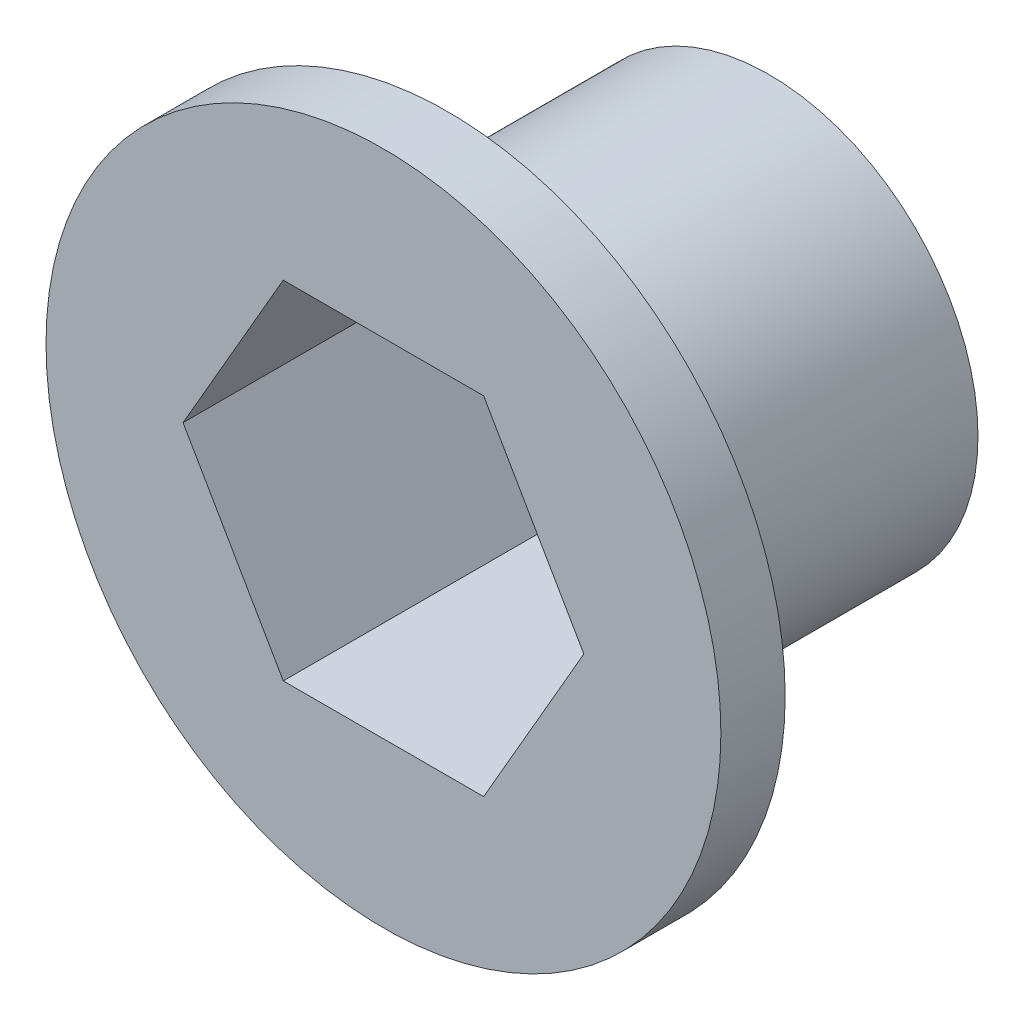
ISO-10303-21;
HEADER;
FILE_DESCRIPTION(('STEP AP214'),'2;1');
FILE_NAME('part.step','',(''),(''),'','','');
FILE_SCHEMA(('AUTOMOTIVE_DESIGN { 1 0 10303 214 1 1 1 1 }'));
ENDSEC;
DATA;
#1=APPLICATION_CONTEXT('core data for automotive mechanical design processes');
#2=APPLICATION_PROTOCOL_DEFINITION('international standard','automotive_design',2000,#1);
#3=PRODUCT_CONTEXT('',#1,'mechanical');
#4=PRODUCT('Part','Part','',(#3));
#5=PRODUCT_RELATED_PRODUCT_CATEGORY('part','',(#4));
#6=PRODUCT_DEFINITION_FORMATION('','',#4);
#7=PRODUCT_DEFINITION_CONTEXT('part definition',#1,'design');
#8=PRODUCT_DEFINITION('design','',#6,#7);
#9=PRODUCT_DEFINITION_SHAPE('','',#8);
#10=(LENGTH_UNIT() NAMED_UNIT(*) SI_UNIT(.MILLI.,.METRE.));
#11=(NAMED_UNIT(*) PLANE_ANGLE_UNIT() SI_UNIT($,.RADIAN.));
#12=(NAMED_UNIT(*) SI_UNIT($,.STERADIAN.) SOLID_ANGLE_UNIT());
#13=UNCERTAINTY_MEASURE_WITH_UNIT(LENGTH_MEASURE(1.E-05),#10,'distance_accuracy_value','');
#14=(GEOMETRIC_REPRESENTATION_CONTEXT(3) GLOBAL_UNCERTAINTY_ASSIGNED_CONTEXT((#13)) GLOBAL_UNIT_ASSIGNED_CONTEXT((#10,
#11,#12)) REPRESENTATION_CONTEXT('',''));
#15=CARTESIAN_POINT('',(0.,0.,0.));
#16=DIRECTION('',(0.,0.,1.));
#17=DIRECTION('',(1.,0.,0.));
#18=AXIS2_PLACEMENT_3D('',#15,#16,#17);
#19=CARTESIAN_POINT('',(0.,0.,-2.5));
#20=DIRECTION('',(0.,0.,1.));
#21=DIRECTION('',(1.,0.,0.));
#22=AXIS2_PLACEMENT_3D('',#19,#20,#21);
#23=PLANE('',#22);
#24=CARTESIAN_POINT('',(0.,0.,-2.5));
#25=DIRECTION('',(0.,0.,1.));
#26=DIRECTION('',(1.,0.,0.));
#27=AXIS2_PLACEMENT_3D('',#24,#25,#26);
#28=CIRCLE('',#27,3.25);
#29=CARTESIAN_POINT('',(3.25,0.,-2.5));
#30=VERTEX_POINT('',#29);
#31=EDGE_CURVE('E41',#30,#30,#28,.T.);
#32=ORIENTED_EDGE('',*,*,#31,.F.);
#33=EDGE_LOOP('',(#32));
#34=FACE_BOUND('',#33,.T.);
#35=DIRECTION('',(0.499999999999995,0.866025403784442,0.));
#36=VECTOR('',#35,1.);
#37=CARTESIAN_POINT('',(1.55884572681201,-2.69999999999997,-2.5));
#38=LINE('',#37,#36);
#39=CARTESIAN_POINT('',(1.55884572681201,-2.69999999999997,-2.5));
#40=VERTEX_POINT('',#39);
#41=CARTESIAN_POINT('',(3.11769145362396,0.,-2.5));
#42=VERTEX_POINT('',#41);
#43=EDGE_CURVE('E52',#40,#42,#38,.T.);
#44=ORIENTED_EDGE('',*,*,#43,.T.);
#45=DIRECTION('',(-0.500000000000001,0.866025403784438,0.));
#46=VECTOR('',#45,1.);
#47=CARTESIAN_POINT('',(3.11769145362396,0.,-2.5));
#48=LINE('',#47,#46);
#49=CARTESIAN_POINT('',(1.55884572681198,2.69999999999999,-2.5));
#50=VERTEX_POINT('',#49);
#51=EDGE_CURVE('E98',#42,#50,#48,.T.);
#52=ORIENTED_EDGE('',*,*,#51,.T.);
#53=DIRECTION('',(-1.,0.,0.));
#54=VECTOR('',#53,1.);
#55=CARTESIAN_POINT('',(1.55884572681198,2.69999999999999,-2.5));
#56=LINE('',#55,#54);
#57=CARTESIAN_POINT('',(-1.55884572681199,2.69999999999998,-2.5));
#58=VERTEX_POINT('',#57);
#59=EDGE_CURVE('E131',#50,#58,#56,.T.);
#60=ORIENTED_EDGE('',*,*,#59,.T.);
#61=DIRECTION('',(-0.499999999999995,-0.866025403784441,0.));
#62=VECTOR('',#61,1.);
#63=CARTESIAN_POINT('',(-1.55884572681199,2.69999999999998,-2.5));
#64=LINE('',#63,#62);
#65=CARTESIAN_POINT('',(-3.11769145362396,0.,-2.5));
#66=VERTEX_POINT('',#65);
#67=EDGE_CURVE('E134',#58,#66,#64,.T.);
#68=ORIENTED_EDGE('',*,*,#67,.T.);
#69=DIRECTION('',(0.500000000000007,-0.866025403784435,0.));
#70=VECTOR('',#69,1.);
#71=CARTESIAN_POINT('',(-3.11769145362396,0.,-2.5));
#72=LINE('',#71,#70);
#73=CARTESIAN_POINT('',(-1.55884572681196,-2.7,-2.5));
#74=VERTEX_POINT('',#73);
#75=EDGE_CURVE('E137',#66,#74,#72,.T.);
#76=ORIENTED_EDGE('',*,*,#75,.T.);
#77=DIRECTION('',(1.,0.,0.));
#78=VECTOR('',#77,1.);
#79=CARTESIAN_POINT('',(-1.55884572681196,-2.7,-2.5));
#80=LINE('',#79,#78);
#81=EDGE_CURVE('E140',#74,#40,#80,.T.);
#82=ORIENTED_EDGE('',*,*,#81,.T.);
#83=EDGE_LOOP('',(#44,#52,#60,#68,#76,#82));
#84=FACE_BOUND('',#83,.T.);
#85=ADVANCED_FACE('F37',(#34,#84),#23,.F.);
#86=CARTESIAN_POINT('',(0.,0.,2.5));
#87=DIRECTION('',(0.,0.,-1.));
#88=DIRECTION('',(-1.,0.,0.));
#89=AXIS2_PLACEMENT_3D('',#86,#87,#88);
#90=CYLINDRICAL_SURFACE('',#89,3.25);
#91=CARTESIAN_POINT('',(0.,0.,2.5));
#92=DIRECTION('',(0.,0.,1.));
#93=DIRECTION('',(1.,0.,0.));
#94=AXIS2_PLACEMENT_3D('',#91,#92,#93);
#95=CIRCLE('',#94,3.25);
#96=CARTESIAN_POINT('',(3.25,0.,2.5));
#97=VERTEX_POINT('',#96);
#98=EDGE_CURVE('E11',#97,#97,#95,.T.);
#99=ORIENTED_EDGE('',*,*,#98,.F.);
#100=EDGE_LOOP('',(#99));
#101=FACE_BOUND('',#100,.T.);
#102=ORIENTED_EDGE('',*,*,#31,.T.);
#103=EDGE_LOOP('',(#102));
#104=FACE_BOUND('',#103,.T.);
#105=ADVANCED_FACE('F39',(#101,#104),#90,.T.);
#106=CARTESIAN_POINT('',(1.55884572681201,-2.69999999999997,2.5));
#107=DIRECTION('',(-0.866025403784442,0.499999999999995,0.));
#108=DIRECTION('',(-0.499999999999995,-0.866025403784442,0.));
#109=AXIS2_PLACEMENT_3D('',#106,#107,#108);
#110=PLANE('',#109);
#111=ORIENTED_EDGE('',*,*,#43,.F.);
#112=DIRECTION('',(0.,0.,-1.));
#113=VECTOR('',#112,1.);
#114=CARTESIAN_POINT('',(1.55884572681201,-2.69999999999997,2.5));
#115=LINE('',#114,#113);
#116=CARTESIAN_POINT('',(1.55884572681199,-2.7,3.5));
#117=VERTEX_POINT('',#116);
#118=EDGE_CURVE('E104',#117,#40,#115,.T.);
#119=ORIENTED_EDGE('',*,*,#118,.F.);
#120=DIRECTION('',(0.5,0.866025403784439,0.));
#121=VECTOR('',#120,1.);
#122=CARTESIAN_POINT('',(1.55884572681199,-2.7,3.5));
#123=LINE('',#122,#121);
#124=CARTESIAN_POINT('',(3.11769145362398,0.,3.5));
#125=VERTEX_POINT('',#124);
#126=EDGE_CURVE('E102',#117,#125,#123,.T.);
#127=ORIENTED_EDGE('',*,*,#126,.T.);
#128=DIRECTION('',(0.,0.,-1.));
#129=VECTOR('',#128,1.);
#130=CARTESIAN_POINT('',(3.11769145362396,0.,2.5));
#131=LINE('',#130,#129);
#132=EDGE_CURVE('E91',#125,#42,#131,.T.);
#133=ORIENTED_EDGE('',*,*,#132,.T.);
#134=EDGE_LOOP('',(#111,#119,#127,#133));
#135=FACE_BOUND('',#134,.T.);
#136=ADVANCED_FACE('F103',(#135),#110,.T.);
#137=CARTESIAN_POINT('',(3.11769145362396,0.,2.5));
#138=DIRECTION('',(-0.866025403784438,-0.500000000000001,0.));
#139=DIRECTION('',(0.500000000000001,-0.866025403784438,0.));
#140=AXIS2_PLACEMENT_3D('',#137,#138,#139);
#141=PLANE('',#140);
#142=ORIENTED_EDGE('',*,*,#51,.F.);
#143=ORIENTED_EDGE('',*,*,#132,.F.);
#144=DIRECTION('',(-0.499999999999999,0.866025403784439,0.));
#145=VECTOR('',#144,1.);
#146=CARTESIAN_POINT('',(3.11769145362398,0.,3.5));
#147=LINE('',#146,#145);
#148=CARTESIAN_POINT('',(1.55884572681199,2.70000000000001,3.5));
#149=VERTEX_POINT('',#148);
#150=EDGE_CURVE('E95',#125,#149,#147,.T.);
#151=ORIENTED_EDGE('',*,*,#150,.T.);
#152=DIRECTION('',(0.,0.,-1.));
#153=VECTOR('',#152,1.);
#154=CARTESIAN_POINT('',(1.55884572681198,2.69999999999999,2.5));
#155=LINE('',#154,#153);
#156=EDGE_CURVE('E99',#149,#50,#155,.T.);
#157=ORIENTED_EDGE('',*,*,#156,.T.);
#158=EDGE_LOOP('',(#142,#143,#151,#157));
#159=FACE_BOUND('',#158,.T.);
#160=ADVANCED_FACE('F93',(#159),#141,.T.);
#161=CARTESIAN_POINT('',(1.55884572681198,2.69999999999999,2.5));
#162=DIRECTION('',(0.,-1.,0.));
#163=DIRECTION('',(1.,0.,0.));
#164=AXIS2_PLACEMENT_3D('',#161,#162,#163);
#165=PLANE('',#164);
#166=ORIENTED_EDGE('',*,*,#59,.F.);
#167=ORIENTED_EDGE('',*,*,#156,.F.);
#168=DIRECTION('',(-1.,0.,0.));
#169=VECTOR('',#168,1.);
#170=CARTESIAN_POINT('',(1.55884572681199,2.70000000000001,3.5));
#171=LINE('',#170,#169);
#172=CARTESIAN_POINT('',(-1.55884572681199,2.7,3.5));
#173=VERTEX_POINT('',#172);
#174=EDGE_CURVE('E112',#149,#173,#171,.T.);
#175=ORIENTED_EDGE('',*,*,#174,.T.);
#176=DIRECTION('',(0.,0.,-1.));
#177=VECTOR('',#176,1.);
#178=CARTESIAN_POINT('',(-1.55884572681199,2.69999999999998,2.5));
#179=LINE('',#178,#177);
#180=EDGE_CURVE('E147',#173,#58,#179,.T.);
#181=ORIENTED_EDGE('',*,*,#180,.T.);
#182=EDGE_LOOP('',(#166,#167,#175,#181));
#183=FACE_BOUND('',#182,.T.);
#184=ADVANCED_FACE('F151',(#183),#165,.T.);
#185=CARTESIAN_POINT('',(-1.55884572681199,2.69999999999998,2.5));
#186=DIRECTION('',(0.866025403784442,-0.499999999999995,0.));
#187=DIRECTION('',(0.499999999999995,0.866025403784442,0.));
#188=AXIS2_PLACEMENT_3D('',#185,#186,#187);
#189=PLANE('',#188);
#190=ORIENTED_EDGE('',*,*,#67,.F.);
#191=ORIENTED_EDGE('',*,*,#180,.F.);
#192=DIRECTION('',(-0.5,-0.866025403784439,0.));
#193=VECTOR('',#192,1.);
#194=CARTESIAN_POINT('',(-1.55884572681199,2.7,3.5));
#195=LINE('',#194,#193);
#196=CARTESIAN_POINT('',(-3.11769145362398,0.,3.5));
#197=VERTEX_POINT('',#196);
#198=EDGE_CURVE('E114',#173,#197,#195,.T.);
#199=ORIENTED_EDGE('',*,*,#198,.T.);
#200=DIRECTION('',(0.,0.,-1.));
#201=VECTOR('',#200,1.);
#202=CARTESIAN_POINT('',(-3.11769145362396,0.,2.5));
#203=LINE('',#202,#201);
#204=EDGE_CURVE('E145',#197,#66,#203,.T.);
#205=ORIENTED_EDGE('',*,*,#204,.T.);
#206=EDGE_LOOP('',(#190,#191,#199,#205));
#207=FACE_BOUND('',#206,.T.);
#208=ADVANCED_FACE('F159',(#207),#189,.T.);
#209=CARTESIAN_POINT('',(-3.11769145362396,0.,2.5));
#210=DIRECTION('',(0.866025403784435,0.500000000000007,0.));
#211=DIRECTION('',(-0.500000000000007,0.866025403784435,0.));
#212=AXIS2_PLACEMENT_3D('',#209,#210,#211);
#213=PLANE('',#212);
#214=ORIENTED_EDGE('',*,*,#75,.F.);
#215=ORIENTED_EDGE('',*,*,#204,.F.);
#216=DIRECTION('',(0.499999999999999,-0.866025403784439,0.));
#217=VECTOR('',#216,1.);
#218=CARTESIAN_POINT('',(-3.11769145362398,0.,3.5));
#219=LINE('',#218,#217);
#220=CARTESIAN_POINT('',(-1.558845726812,-2.7,3.5));
#221=VERTEX_POINT('',#220);
#222=EDGE_CURVE('E119',#197,#221,#219,.T.);
#223=ORIENTED_EDGE('',*,*,#222,.T.);
#224=DIRECTION('',(0.,0.,-1.));
#225=VECTOR('',#224,1.);
#226=CARTESIAN_POINT('',(-1.55884572681196,-2.7,2.5));
#227=LINE('',#226,#225);
#228=EDGE_CURVE('E60',#221,#74,#227,.T.);
#229=ORIENTED_EDGE('',*,*,#228,.T.);
#230=EDGE_LOOP('',(#214,#215,#223,#229));
#231=FACE_BOUND('',#230,.T.);
#232=ADVANCED_FACE('F157',(#231),#213,.T.);
#233=CARTESIAN_POINT('',(-1.55884572681196,-2.7,2.5));
#234=DIRECTION('',(0.,1.,0.));
#235=DIRECTION('',(-1.,0.,0.));
#236=AXIS2_PLACEMENT_3D('',#233,#234,#235);
#237=PLANE('',#236);
#238=ORIENTED_EDGE('',*,*,#81,.F.);
#239=ORIENTED_EDGE('',*,*,#228,.F.);
#240=DIRECTION('',(1.,0.,0.));
#241=VECTOR('',#240,1.);
#242=CARTESIAN_POINT('',(-1.558845726812,-2.7,3.5));
#243=LINE('',#242,#241);
#244=EDGE_CURVE('E121',#221,#117,#243,.T.);
#245=ORIENTED_EDGE('',*,*,#244,.T.);
#246=ORIENTED_EDGE('',*,*,#118,.T.);
#247=EDGE_LOOP('',(#238,#239,#245,#246));
#248=FACE_BOUND('',#247,.T.);
#249=ADVANCED_FACE('F155',(#248),#237,.T.);
#250=CARTESIAN_POINT('',(0.,0.,3.5));
#251=DIRECTION('',(0.,0.,1.));
#252=DIRECTION('',(1.,0.,0.));
#253=AXIS2_PLACEMENT_3D('',#250,#251,#252);
#254=PLANE('',#253);
#255=CARTESIAN_POINT('',(0.,0.,3.5));
#256=DIRECTION('',(0.,0.,1.));
#257=DIRECTION('',(1.,0.,0.));
#258=AXIS2_PLACEMENT_3D('',#255,#256,#257);
#259=CIRCLE('',#258,5.25);
#260=CARTESIAN_POINT('',(5.25,0.,3.5));
#261=VERTEX_POINT('',#260);
#262=EDGE_CURVE('E124',#261,#261,#259,.T.);
#263=ORIENTED_EDGE('',*,*,#262,.T.);
#264=EDGE_LOOP('',(#263));
#265=FACE_BOUND('',#264,.T.);
#266=ORIENTED_EDGE('',*,*,#150,.F.);
#267=ORIENTED_EDGE('',*,*,#126,.F.);
#268=ORIENTED_EDGE('',*,*,#244,.F.);
#269=ORIENTED_EDGE('',*,*,#222,.F.);
#270=ORIENTED_EDGE('',*,*,#198,.F.);
#271=ORIENTED_EDGE('',*,*,#174,.F.);
#272=EDGE_LOOP('',(#266,#267,#268,#269,#270,#271));
#273=FACE_BOUND('',#272,.T.);
#274=ADVANCED_FACE('F109',(#265,#273),#254,.T.);
#275=CARTESIAN_POINT('',(0.,0.,2.5));
#276=DIRECTION('',(0.,0.,1.));
#277=DIRECTION('',(1.,0.,0.));
#278=AXIS2_PLACEMENT_3D('',#275,#276,#277);
#279=PLANE('',#278);
#280=ORIENTED_EDGE('',*,*,#98,.T.);
#281=EDGE_LOOP('',(#280));
#282=FACE_BOUND('',#281,.T.);
#283=CARTESIAN_POINT('',(0.,0.,2.5));
#284=DIRECTION('',(0.,0.,1.));
#285=DIRECTION('',(1.,0.,0.));
#286=AXIS2_PLACEMENT_3D('',#283,#284,#285);
#287=CIRCLE('',#286,5.25);
#288=CARTESIAN_POINT('',(5.25,0.,2.5));
#289=VERTEX_POINT('',#288);
#290=EDGE_CURVE('E123',#289,#289,#287,.T.);
#291=ORIENTED_EDGE('',*,*,#290,.F.);
#292=EDGE_LOOP('',(#291));
#293=FACE_BOUND('',#292,.T.);
#294=ADVANCED_FACE('F218',(#282,#293),#279,.F.);
#295=CARTESIAN_POINT('',(0.,0.,3.5));
#296=DIRECTION('',(0.,0.,-1.));
#297=DIRECTION('',(-1.,0.,0.));
#298=AXIS2_PLACEMENT_3D('',#295,#296,#297);
#299=CYLINDRICAL_SURFACE('',#298,5.25);
#300=ORIENTED_EDGE('',*,*,#262,.F.);
#301=EDGE_LOOP('',(#300));
#302=FACE_BOUND('',#301,.T.);
#303=ORIENTED_EDGE('',*,*,#290,.T.);
#304=EDGE_LOOP('',(#303));
#305=FACE_BOUND('',#304,.T.);
#306=ADVANCED_FACE('F229',(#302,#305),#299,.T.);
#307=CLOSED_SHELL('',(#85,#105,#136,#160,#184,#208,#232,#249,#274,#294,#306));
#308=MANIFOLD_SOLID_BREP('B2',#307);
#309=ADVANCED_BREP_SHAPE_REPRESENTATION('',(#18,#308),#14);
#310=SHAPE_DEFINITION_REPRESENTATION(#9,#309);
ENDSEC;
END-ISO-10303-21;
